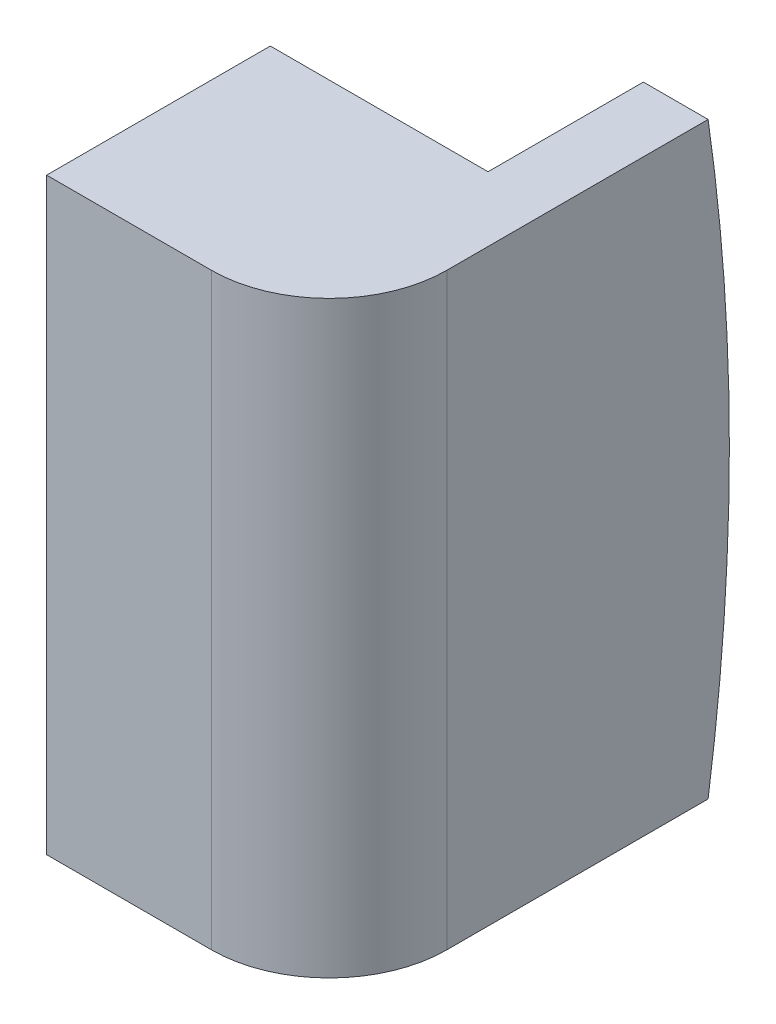
ISO-10303-21;
HEADER;
FILE_DESCRIPTION(('STEP AP214'),'2;1');
FILE_NAME('part.step','',(''),(''),'','','');
FILE_SCHEMA(('AUTOMOTIVE_DESIGN { 1 0 10303 214 1 1 1 1 }'));
ENDSEC;
DATA;
#1=APPLICATION_CONTEXT('core data for automotive mechanical design processes');
#2=APPLICATION_PROTOCOL_DEFINITION('international standard','automotive_design',2000,#1);
#3=PRODUCT_CONTEXT('',#1,'mechanical');
#4=PRODUCT('Part','Part','',(#3));
#5=PRODUCT_RELATED_PRODUCT_CATEGORY('part','',(#4));
#6=PRODUCT_DEFINITION_FORMATION('','',#4);
#7=PRODUCT_DEFINITION_CONTEXT('part definition',#1,'design');
#8=PRODUCT_DEFINITION('design','',#6,#7);
#9=PRODUCT_DEFINITION_SHAPE('','',#8);
#10=(LENGTH_UNIT() NAMED_UNIT(*) SI_UNIT(.MILLI.,.METRE.));
#11=(NAMED_UNIT(*) PLANE_ANGLE_UNIT() SI_UNIT($,.RADIAN.));
#12=(NAMED_UNIT(*) SI_UNIT($,.STERADIAN.) SOLID_ANGLE_UNIT());
#13=UNCERTAINTY_MEASURE_WITH_UNIT(LENGTH_MEASURE(1.E-05),#10,'distance_accuracy_value','');
#14=(GEOMETRIC_REPRESENTATION_CONTEXT(3) GLOBAL_UNCERTAINTY_ASSIGNED_CONTEXT((#13)) GLOBAL_UNIT_ASSIGNED_CONTEXT((#10,
#11,#12)) REPRESENTATION_CONTEXT('',''));
#15=CARTESIAN_POINT('',(0.,0.,0.));
#16=DIRECTION('',(0.,0.,1.));
#17=DIRECTION('',(1.,0.,0.));
#18=AXIS2_PLACEMENT_3D('',#15,#16,#17);
#19=CARTESIAN_POINT('',(118.8,2.5,-17.4));
#20=DIRECTION('',(-1.,0.,0.));
#21=DIRECTION('',(0.,0.,1.));
#22=AXIS2_PLACEMENT_3D('',#19,#20,#21);
#23=PLANE('',#22);
#24=CARTESIAN_POINT('',(118.8,0.,0.));
#25=DIRECTION('',(-1.,0.,0.));
#26=DIRECTION('',(0.,0.143678160919503,-0.989624467196921));
#27=AXIS2_PLACEMENT_3D('',#24,#25,#26);
#28=CIRCLE('',#27,17.4);
#29=CARTESIAN_POINT('',(118.8,2.5,-17.21946572923));
#30=VERTEX_POINT('',#29);
#31=CARTESIAN_POINT('',(118.8,-2.5,-17.21946572923));
#32=VERTEX_POINT('',#31);
#33=EDGE_CURVE('E134',#30,#32,#28,.T.);
#34=ORIENTED_EDGE('',*,*,#33,.T.);
#35=DIRECTION('',(0.,0.,-1.));
#36=VECTOR('',#35,1.);
#37=CARTESIAN_POINT('',(118.8,-2.5,-15.9));
#38=LINE('',#37,#36);
#39=CARTESIAN_POINT('',(118.8,-2.5,-15.9));
#40=VERTEX_POINT('',#39);
#41=EDGE_CURVE('E129',#40,#32,#38,.T.);
#42=ORIENTED_EDGE('',*,*,#41,.F.);
#43=DIRECTION('',(0.,1.,0.));
#44=VECTOR('',#43,1.);
#45=CARTESIAN_POINT('',(118.8,-2.5,-15.9));
#46=LINE('',#45,#44);
#47=CARTESIAN_POINT('',(118.8,2.5,-15.9));
#48=VERTEX_POINT('',#47);
#49=EDGE_CURVE('E11',#40,#48,#46,.T.);
#50=ORIENTED_EDGE('',*,*,#49,.T.);
#51=DIRECTION('',(0.,0.,-1.));
#52=VECTOR('',#51,1.);
#53=CARTESIAN_POINT('',(118.8,2.5,-15.9));
#54=LINE('',#53,#52);
#55=EDGE_CURVE('E146',#48,#30,#54,.T.);
#56=ORIENTED_EDGE('',*,*,#55,.T.);
#57=EDGE_LOOP('',(#34,#42,#50,#56));
#58=FACE_BOUND('',#57,.T.);
#59=ADVANCED_FACE('F17',(#58),#23,.T.);
#60=CARTESIAN_POINT('',(118.8,2.5,-15.9));
#61=DIRECTION('',(0.,0.,-1.));
#62=DIRECTION('',(0.,-1.,0.));
#63=AXIS2_PLACEMENT_3D('',#60,#61,#62);
#64=PLANE('',#63);
#65=DIRECTION('',(1.,0.,0.));
#66=VECTOR('',#65,1.);
#67=CARTESIAN_POINT('',(116.95,-2.5,-15.9));
#68=LINE('',#67,#66);
#69=CARTESIAN_POINT('',(116.95,-2.5,-15.9));
#70=VERTEX_POINT('',#69);
#71=EDGE_CURVE('E150',#70,#40,#68,.T.);
#72=ORIENTED_EDGE('',*,*,#71,.F.);
#73=DIRECTION('',(0.,1.,0.));
#74=VECTOR('',#73,1.);
#75=CARTESIAN_POINT('',(116.95,-2.5,-15.9));
#76=LINE('',#75,#74);
#77=CARTESIAN_POINT('',(116.95,2.5,-15.9));
#78=VERTEX_POINT('',#77);
#79=EDGE_CURVE('E28',#70,#78,#76,.T.);
#80=ORIENTED_EDGE('',*,*,#79,.T.);
#81=DIRECTION('',(1.,0.,0.));
#82=VECTOR('',#81,1.);
#83=CARTESIAN_POINT('',(116.95,2.5,-15.9));
#84=LINE('',#83,#82);
#85=EDGE_CURVE('E143',#78,#48,#84,.T.);
#86=ORIENTED_EDGE('',*,*,#85,.T.);
#87=ORIENTED_EDGE('',*,*,#49,.F.);
#88=EDGE_LOOP('',(#72,#80,#86,#87));
#89=FACE_BOUND('',#88,.T.);
#90=ADVANCED_FACE('F181',(#89),#64,.T.);
#91=CARTESIAN_POINT('',(116.95,2.5,-15.9));
#92=DIRECTION('',(-1.,0.,0.));
#93=DIRECTION('',(0.,0.,1.));
#94=AXIS2_PLACEMENT_3D('',#91,#92,#93);
#95=PLANE('',#94);
#96=DIRECTION('',(0.,0.,-1.));
#97=VECTOR('',#96,1.);
#98=CARTESIAN_POINT('',(116.95,-2.5,-14.));
#99=LINE('',#98,#97);
#100=CARTESIAN_POINT('',(116.95,-2.5,-14.));
#101=VERTEX_POINT('',#100);
#102=EDGE_CURVE('E141',#101,#70,#99,.T.);
#103=ORIENTED_EDGE('',*,*,#102,.F.);
#104=DIRECTION('',(0.,1.,0.));
#105=VECTOR('',#104,1.);
#106=CARTESIAN_POINT('',(116.95,-2.5,-14.));
#107=LINE('',#106,#105);
#108=CARTESIAN_POINT('',(116.95,2.5,-14.));
#109=VERTEX_POINT('',#108);
#110=EDGE_CURVE('E42',#101,#109,#107,.T.);
#111=ORIENTED_EDGE('',*,*,#110,.T.);
#112=DIRECTION('',(0.,0.,-1.));
#113=VECTOR('',#112,1.);
#114=CARTESIAN_POINT('',(116.95,2.5,-14.));
#115=LINE('',#114,#113);
#116=EDGE_CURVE('E21',#109,#78,#115,.T.);
#117=ORIENTED_EDGE('',*,*,#116,.T.);
#118=ORIENTED_EDGE('',*,*,#79,.F.);
#119=EDGE_LOOP('',(#103,#111,#117,#118));
#120=FACE_BOUND('',#119,.T.);
#121=ADVANCED_FACE('F19',(#120),#95,.T.);
#122=CARTESIAN_POINT('',(116.95,2.5,-14.));
#123=DIRECTION('',(0.,0.,1.));
#124=DIRECTION('',(1.,0.,0.));
#125=AXIS2_PLACEMENT_3D('',#122,#123,#124);
#126=PLANE('',#125);
#127=DIRECTION('',(-1.,0.,0.));
#128=VECTOR('',#127,1.);
#129=CARTESIAN_POINT('',(118.35,-2.5,-14.));
#130=LINE('',#129,#128);
#131=CARTESIAN_POINT('',(118.35,-2.5,-14.));
#132=VERTEX_POINT('',#131);
#133=EDGE_CURVE('E107',#132,#101,#130,.T.);
#134=ORIENTED_EDGE('',*,*,#133,.F.);
#135=DIRECTION('',(0.,-1.,0.));
#136=VECTOR('',#135,1.);
#137=CARTESIAN_POINT('',(118.35,2.5,-14.));
#138=LINE('',#137,#136);
#139=CARTESIAN_POINT('',(118.35,2.5,-14.));
#140=VERTEX_POINT('',#139);
#141=EDGE_CURVE('E122',#140,#132,#138,.T.);
#142=ORIENTED_EDGE('',*,*,#141,.F.);
#143=DIRECTION('',(-1.,0.,0.));
#144=VECTOR('',#143,1.);
#145=CARTESIAN_POINT('',(118.35,2.5,-14.));
#146=LINE('',#145,#144);
#147=EDGE_CURVE('E155',#140,#109,#146,.T.);
#148=ORIENTED_EDGE('',*,*,#147,.T.);
#149=ORIENTED_EDGE('',*,*,#110,.F.);
#150=EDGE_LOOP('',(#134,#142,#148,#149));
#151=FACE_BOUND('',#150,.T.);
#152=ADVANCED_FACE('F234',(#151),#126,.T.);
#153=CARTESIAN_POINT('',(118.3440577853,2.5,-15.52515318502));
#154=DIRECTION('',(0.,-1.,0.));
#155=DIRECTION('',(0.,0.,-1.));
#156=AXIS2_PLACEMENT_3D('',#153,#154,#155);
#157=PLANE('',#156);
#158=DIRECTION('',(1.,0.,0.));
#159=VECTOR('',#158,1.);
#160=CARTESIAN_POINT('',(118.8,2.5,-17.21946572923));
#161=LINE('',#160,#159);
#162=CARTESIAN_POINT('',(119.35,2.5,-17.21946572923));
#163=VERTEX_POINT('',#162);
#164=EDGE_CURVE('E138',#30,#163,#161,.T.);
#165=ORIENTED_EDGE('',*,*,#164,.F.);
#166=ORIENTED_EDGE('',*,*,#55,.F.);
#167=ORIENTED_EDGE('',*,*,#85,.F.);
#168=ORIENTED_EDGE('',*,*,#116,.F.);
#169=ORIENTED_EDGE('',*,*,#147,.F.);
#170=CARTESIAN_POINT('',(118.35,2.5,-15.));
#171=DIRECTION('',(0.,1.,0.));
#172=DIRECTION('',(0.,0.,1.));
#173=AXIS2_PLACEMENT_3D('',#170,#171,#172);
#174=CIRCLE('',#173,1.);
#175=CARTESIAN_POINT('',(119.35,2.5,-15.));
#176=VERTEX_POINT('',#175);
#177=EDGE_CURVE('E117',#140,#176,#174,.T.);
#178=ORIENTED_EDGE('',*,*,#177,.T.);
#179=DIRECTION('',(0.,0.,1.));
#180=VECTOR('',#179,1.);
#181=CARTESIAN_POINT('',(119.35,2.5,-17.21946572923));
#182=LINE('',#181,#180);
#183=EDGE_CURVE('E112',#163,#176,#182,.T.);
#184=ORIENTED_EDGE('',*,*,#183,.F.);
#185=EDGE_LOOP('',(#165,#166,#167,#168,#169,#178,#184));
#186=FACE_BOUND('',#185,.T.);
#187=ADVANCED_FACE('F187',(#186),#157,.F.);
#188=CARTESIAN_POINT('',(119.35,2.5,-15.));
#189=DIRECTION('',(1.,0.,0.));
#190=DIRECTION('',(0.,1.,0.));
#191=AXIS2_PLACEMENT_3D('',#188,#189,#190);
#192=PLANE('',#191);
#193=CARTESIAN_POINT('',(119.35,0.,0.));
#194=DIRECTION('',(1.,0.,0.));
#195=DIRECTION('',(0.,-0.143678160919503,-0.989624467196921));
#196=AXIS2_PLACEMENT_3D('',#193,#194,#195);
#197=CIRCLE('',#196,17.4);
#198=CARTESIAN_POINT('',(119.35,-2.5,-17.21946572923));
#199=VERTEX_POINT('',#198);
#200=EDGE_CURVE('E139',#199,#163,#197,.T.);
#201=ORIENTED_EDGE('',*,*,#200,.T.);
#202=ORIENTED_EDGE('',*,*,#183,.T.);
#203=DIRECTION('',(0.,1.,0.));
#204=VECTOR('',#203,1.);
#205=CARTESIAN_POINT('',(119.35,-2.5,-15.));
#206=LINE('',#205,#204);
#207=CARTESIAN_POINT('',(119.35,-2.5,-15.));
#208=VERTEX_POINT('',#207);
#209=EDGE_CURVE('E110',#208,#176,#206,.T.);
#210=ORIENTED_EDGE('',*,*,#209,.F.);
#211=DIRECTION('',(0.,0.,1.));
#212=VECTOR('',#211,1.);
#213=CARTESIAN_POINT('',(119.35,-2.5,-17.21946572923));
#214=LINE('',#213,#212);
#215=EDGE_CURVE('E95',#199,#208,#214,.T.);
#216=ORIENTED_EDGE('',*,*,#215,.F.);
#217=EDGE_LOOP('',(#201,#202,#210,#216));
#218=FACE_BOUND('',#217,.T.);
#219=ADVANCED_FACE('F111',(#218),#192,.T.);
#220=CARTESIAN_POINT('',(118.95,0.,0.));
#221=DIRECTION('',(-1.,0.,0.));
#222=DIRECTION('',(0.,1.,0.));
#223=AXIS2_PLACEMENT_3D('',#220,#221,#222);
#224=CYLINDRICAL_SURFACE('',#223,17.4);
#225=ORIENTED_EDGE('',*,*,#200,.F.);
#226=DIRECTION('',(-1.,0.,0.));
#227=VECTOR('',#226,1.);
#228=CARTESIAN_POINT('',(119.35,-2.5,-17.21946572923));
#229=LINE('',#228,#227);
#230=EDGE_CURVE('E103',#199,#32,#229,.T.);
#231=ORIENTED_EDGE('',*,*,#230,.T.);
#232=ORIENTED_EDGE('',*,*,#33,.F.);
#233=ORIENTED_EDGE('',*,*,#164,.T.);
#234=EDGE_LOOP('',(#225,#231,#232,#233));
#235=FACE_BOUND('',#234,.T.);
#236=ADVANCED_FACE('F253',(#235),#224,.T.);
#237=CARTESIAN_POINT('',(118.3440577853,-2.5,-15.52515318502));
#238=DIRECTION('',(0.,-1.,0.));
#239=DIRECTION('',(0.,0.,-1.));
#240=AXIS2_PLACEMENT_3D('',#237,#238,#239);
#241=PLANE('',#240);
#242=ORIENTED_EDGE('',*,*,#230,.F.);
#243=ORIENTED_EDGE('',*,*,#215,.T.);
#244=CARTESIAN_POINT('',(118.35,-2.5,-15.));
#245=DIRECTION('',(0.,-1.,0.));
#246=DIRECTION('',(1.,0.,0.));
#247=AXIS2_PLACEMENT_3D('',#244,#245,#246);
#248=CIRCLE('',#247,1.);
#249=EDGE_CURVE('E100',#208,#132,#248,.T.);
#250=ORIENTED_EDGE('',*,*,#249,.T.);
#251=ORIENTED_EDGE('',*,*,#133,.T.);
#252=ORIENTED_EDGE('',*,*,#102,.T.);
#253=ORIENTED_EDGE('',*,*,#71,.T.);
#254=ORIENTED_EDGE('',*,*,#41,.T.);
#255=EDGE_LOOP('',(#242,#243,#250,#251,#252,#253,#254));
#256=FACE_BOUND('',#255,.T.);
#257=ADVANCED_FACE('F97',(#256),#241,.T.);
#258=CARTESIAN_POINT('',(118.35,2.5,-15.));
#259=DIRECTION('',(0.,1.,0.));
#260=DIRECTION('',(1.,0.,0.));
#261=AXIS2_PLACEMENT_3D('',#258,#259,#260);
#262=CYLINDRICAL_SURFACE('',#261,1.);
#263=ORIENTED_EDGE('',*,*,#249,.F.);
#264=ORIENTED_EDGE('',*,*,#209,.T.);
#265=ORIENTED_EDGE('',*,*,#177,.F.);
#266=ORIENTED_EDGE('',*,*,#141,.T.);
#267=EDGE_LOOP('',(#263,#264,#265,#266));
#268=FACE_BOUND('',#267,.T.);
#269=ADVANCED_FACE('F120',(#268),#262,.T.);
#270=CLOSED_SHELL('',(#59,#90,#121,#152,#187,#219,#236,#257,#269));
#271=MANIFOLD_SOLID_BREP('B1',#270);
#272=ADVANCED_BREP_SHAPE_REPRESENTATION('',(#18,#271),#14);
#273=SHAPE_DEFINITION_REPRESENTATION(#9,#272);
ENDSEC;
END-ISO-10303-21;
